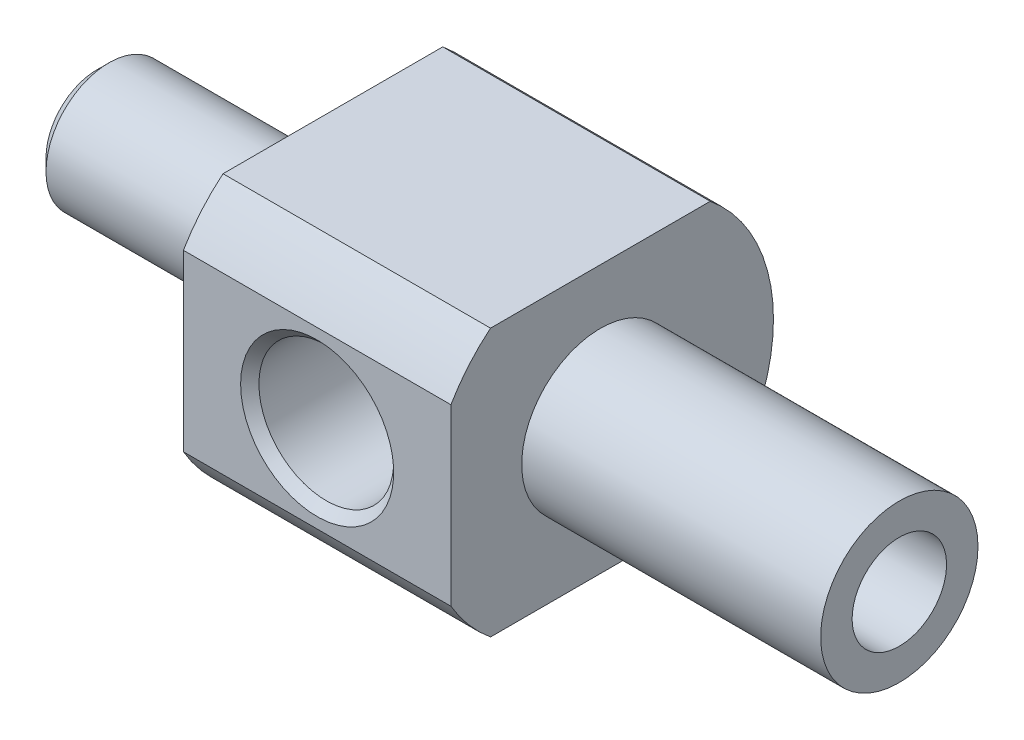
ISO-10303-21;
HEADER;
FILE_DESCRIPTION(('STEP AP214'),'2;1');
FILE_NAME('part.step','',(''),(''),'','','');
FILE_SCHEMA(('AUTOMOTIVE_DESIGN { 1 0 10303 214 1 1 1 1 }'));
ENDSEC;
DATA;
#1=APPLICATION_CONTEXT('core data for automotive mechanical design processes');
#2=APPLICATION_PROTOCOL_DEFINITION('international standard','automotive_design',2000,#1);
#3=PRODUCT_CONTEXT('',#1,'mechanical');
#4=PRODUCT('Part','Part','',(#3));
#5=PRODUCT_RELATED_PRODUCT_CATEGORY('part','',(#4));
#6=PRODUCT_DEFINITION_FORMATION('','',#4);
#7=PRODUCT_DEFINITION_CONTEXT('part definition',#1,'design');
#8=PRODUCT_DEFINITION('design','',#6,#7);
#9=PRODUCT_DEFINITION_SHAPE('','',#8);
#10=(LENGTH_UNIT() NAMED_UNIT(*) SI_UNIT(.MILLI.,.METRE.));
#11=(NAMED_UNIT(*) PLANE_ANGLE_UNIT() SI_UNIT($,.RADIAN.));
#12=(NAMED_UNIT(*) SI_UNIT($,.STERADIAN.) SOLID_ANGLE_UNIT());
#13=UNCERTAINTY_MEASURE_WITH_UNIT(LENGTH_MEASURE(1.E-05),#10,'distance_accuracy_value','');
#14=(GEOMETRIC_REPRESENTATION_CONTEXT(3) GLOBAL_UNCERTAINTY_ASSIGNED_CONTEXT((#13)) GLOBAL_UNIT_ASSIGNED_CONTEXT((#10,
#11,#12)) REPRESENTATION_CONTEXT('',''));
#15=CARTESIAN_POINT('',(0.,0.,0.));
#16=DIRECTION('',(0.,0.,1.));
#17=DIRECTION('',(1.,0.,0.));
#18=AXIS2_PLACEMENT_3D('',#15,#16,#17);
#19=CARTESIAN_POINT('',(19.,9.9192956952868,0.));
#20=DIRECTION('',(1.,0.,0.));
#21=DIRECTION('',(0.,0.,-1.));
#22=AXIS2_PLACEMENT_3D('',#19,#20,#21);
#23=PLANE('',#22);
#24=CARTESIAN_POINT('',(19.,0.,0.));
#25=DIRECTION('',(-1.,0.,0.));
#26=DIRECTION('',(0.,0.,1.));
#27=AXIS2_PLACEMENT_3D('',#24,#25,#26);
#28=CIRCLE('',#27,3.);
#29=CARTESIAN_POINT('',(19.,0.,3.));
#30=VERTEX_POINT('',#29);
#31=EDGE_CURVE('E89',#30,#30,#28,.T.);
#32=ORIENTED_EDGE('',*,*,#31,.T.);
#33=EDGE_LOOP('',(#32));
#34=FACE_BOUND('',#33,.T.);
#35=CARTESIAN_POINT('',(19.,0.,0.));
#36=DIRECTION('',(1.,0.,0.));
#37=DIRECTION('',(0.,0.,-1.));
#38=AXIS2_PLACEMENT_3D('',#35,#36,#37);
#39=CIRCLE('',#38,5.);
#40=CARTESIAN_POINT('',(19.,0.,-5.));
#41=VERTEX_POINT('',#40);
#42=EDGE_CURVE('E222',#41,#41,#39,.T.);
#43=ORIENTED_EDGE('',*,*,#42,.T.);
#44=EDGE_LOOP('',(#43));
#45=FACE_BOUND('',#44,.T.);
#46=ADVANCED_FACE('F17',(#34,#45),#23,.T.);
#47=CARTESIAN_POINT('',(-17.,5.5452682532047,9.5));
#48=DIRECTION('',(0.,0.,1.));
#49=DIRECTION('',(1.,0.,0.));
#50=AXIS2_PLACEMENT_3D('',#47,#48,#49);
#51=PLANE('',#50);
#52=DIRECTION('',(0.,-1.,0.));
#53=VECTOR('',#52,1.);
#54=CARTESIAN_POINT('',(0.,5.5452682532047,9.5));
#55=LINE('',#54,#53);
#56=CARTESIAN_POINT('',(0.,5.5452682532047,9.5));
#57=VERTEX_POINT('',#56);
#58=CARTESIAN_POINT('',(0.,-5.5452682532047,9.5));
#59=VERTEX_POINT('',#58);
#60=EDGE_CURVE('E128',#57,#59,#55,.T.);
#61=ORIENTED_EDGE('',*,*,#60,.F.);
#62=DIRECTION('',(1.,0.,0.));
#63=VECTOR('',#62,1.);
#64=CARTESIAN_POINT('',(-17.,5.5452682532047,9.5));
#65=LINE('',#64,#63);
#66=CARTESIAN_POINT('',(-17.,5.5452682532047,9.5));
#67=VERTEX_POINT('',#66);
#68=EDGE_CURVE('E29',#67,#57,#65,.T.);
#69=ORIENTED_EDGE('',*,*,#68,.F.);
#70=DIRECTION('',(0.,-1.,0.));
#71=VECTOR('',#70,1.);
#72=CARTESIAN_POINT('',(-17.,5.5452682532047,9.5));
#73=LINE('',#72,#71);
#74=CARTESIAN_POINT('',(-17.,-5.5452682532047,9.5));
#75=VERTEX_POINT('',#74);
#76=EDGE_CURVE('E149',#67,#75,#73,.T.);
#77=ORIENTED_EDGE('',*,*,#76,.T.);
#78=DIRECTION('',(1.,0.,0.));
#79=VECTOR('',#78,1.);
#80=CARTESIAN_POINT('',(-17.,-5.5452682532047,9.5));
#81=LINE('',#80,#79);
#82=EDGE_CURVE('E172',#75,#59,#81,.T.);
#83=ORIENTED_EDGE('',*,*,#82,.T.);
#84=EDGE_LOOP('',(#61,#69,#77,#83));
#85=FACE_BOUND('',#84,.T.);
#86=CARTESIAN_POINT('',(-8.5,0.,9.5));
#87=DIRECTION('',(0.,0.,-1.));
#88=DIRECTION('',(-1.,0.,0.));
#89=AXIS2_PLACEMENT_3D('',#86,#87,#88);
#90=CIRCLE('',#89,4.864);
#91=CARTESIAN_POINT('',(-13.364,0.,9.5));
#92=VERTEX_POINT('',#91);
#93=EDGE_CURVE('E96',#92,#92,#90,.T.);
#94=ORIENTED_EDGE('',*,*,#93,.T.);
#95=EDGE_LOOP('',(#94));
#96=FACE_BOUND('',#95,.T.);
#97=ADVANCED_FACE('F192',(#85,#96),#51,.T.);
#98=CARTESIAN_POINT('',(0.,-3.46944695195362E-13,-5.10008701937181E-13));
#99=DIRECTION('',(1.,0.,0.));
#100=DIRECTION('',(0.,1.,0.));
#101=AXIS2_PLACEMENT_3D('',#98,#99,#100);
#102=PLANE('',#101);
#103=DIRECTION('',(0.,0.,-1.));
#104=VECTOR('',#103,1.);
#105=CARTESIAN_POINT('',(0.,-8.5,6.9821200218845));
#106=LINE('',#105,#104);
#107=CARTESIAN_POINT('',(0.,-8.5,6.9821200218845));
#108=VERTEX_POINT('',#107);
#109=CARTESIAN_POINT('',(0.,-8.5,-6.9821200218845));
#110=VERTEX_POINT('',#109);
#111=EDGE_CURVE('E135',#108,#110,#106,.T.);
#112=ORIENTED_EDGE('',*,*,#111,.T.);
#113=CARTESIAN_POINT('',(0.,0.,0.));
#114=DIRECTION('',(1.,0.,0.));
#115=DIRECTION('',(0.,1.,0.));
#116=AXIS2_PLACEMENT_3D('',#113,#114,#115);
#117=CIRCLE('',#116,11.);
#118=CARTESIAN_POINT('',(0.,8.5,-6.9821200218845));
#119=VERTEX_POINT('',#118);
#120=EDGE_CURVE('E138',#110,#119,#117,.T.);
#121=ORIENTED_EDGE('',*,*,#120,.T.);
#122=DIRECTION('',(0.,0.,1.));
#123=VECTOR('',#122,1.);
#124=CARTESIAN_POINT('',(0.,8.5,-6.9821200218845));
#125=LINE('',#124,#123);
#126=CARTESIAN_POINT('',(0.,8.5,6.9821200218845));
#127=VERTEX_POINT('',#126);
#128=EDGE_CURVE('E142',#119,#127,#125,.T.);
#129=ORIENTED_EDGE('',*,*,#128,.T.);
#130=CARTESIAN_POINT('',(0.,-3.46944695195362E-13,-5.10008701937181E-13));
#131=DIRECTION('',(1.,0.,0.));
#132=DIRECTION('',(0.,1.,0.));
#133=AXIS2_PLACEMENT_3D('',#130,#131,#132);
#134=CIRCLE('',#133,11.0000000000006);
#135=EDGE_CURVE('E127',#127,#57,#134,.T.);
#136=ORIENTED_EDGE('',*,*,#135,.T.);
#137=ORIENTED_EDGE('',*,*,#60,.T.);
#138=CARTESIAN_POINT('',(0.,3.46944695195362E-13,-5.09141340199193E-13));
#139=DIRECTION('',(1.,0.,0.));
#140=DIRECTION('',(0.,1.,0.));
#141=AXIS2_PLACEMENT_3D('',#138,#139,#140);
#142=CIRCLE('',#141,11.0000000000006);
#143=EDGE_CURVE('E131',#59,#108,#142,.T.);
#144=ORIENTED_EDGE('',*,*,#143,.T.);
#145=EDGE_LOOP('',(#112,#121,#129,#136,#137,#144));
#146=FACE_BOUND('',#145,.T.);
#147=CARTESIAN_POINT('',(0.,0.,0.));
#148=DIRECTION('',(1.,0.,0.));
#149=DIRECTION('',(0.,0.,-1.));
#150=AXIS2_PLACEMENT_3D('',#147,#148,#149);
#151=CIRCLE('',#150,5.);
#152=CARTESIAN_POINT('',(0.,0.,-5.));
#153=VERTEX_POINT('',#152);
#154=EDGE_CURVE('E224',#153,#153,#151,.T.);
#155=ORIENTED_EDGE('',*,*,#154,.F.);
#156=EDGE_LOOP('',(#155));
#157=FACE_BOUND('',#156,.T.);
#158=ADVANCED_FACE('F180',(#146,#157),#102,.T.);
#159=CARTESIAN_POINT('',(-17.,-3.46944695195362E-13,-5.10008701937181E-13));
#160=DIRECTION('',(1.,0.,0.));
#161=DIRECTION('',(0.,0.,-1.));
#162=AXIS2_PLACEMENT_3D('',#159,#160,#161);
#163=CYLINDRICAL_SURFACE('',#162,11.0000000000006);
#164=ORIENTED_EDGE('',*,*,#135,.F.);
#165=DIRECTION('',(1.,0.,0.));
#166=VECTOR('',#165,1.);
#167=CARTESIAN_POINT('',(-17.,8.5,6.9821200218845));
#168=LINE('',#167,#166);
#169=CARTESIAN_POINT('',(-17.,8.5,6.9821200218845));
#170=VERTEX_POINT('',#169);
#171=EDGE_CURVE('E42',#170,#127,#168,.T.);
#172=ORIENTED_EDGE('',*,*,#171,.F.);
#173=CARTESIAN_POINT('',(-17.,-3.46944695195362E-13,-5.10008701937181E-13));
#174=DIRECTION('',(1.,0.,0.));
#175=DIRECTION('',(0.,1.,0.));
#176=AXIS2_PLACEMENT_3D('',#173,#174,#175);
#177=CIRCLE('',#176,11.0000000000006);
#178=EDGE_CURVE('E145',#170,#67,#177,.T.);
#179=ORIENTED_EDGE('',*,*,#178,.T.);
#180=ORIENTED_EDGE('',*,*,#68,.T.);
#181=EDGE_LOOP('',(#164,#172,#179,#180));
#182=FACE_BOUND('',#181,.T.);
#183=ADVANCED_FACE('F175',(#182),#163,.T.);
#184=CARTESIAN_POINT('',(-17.,3.46944695195362E-13,-5.09141340199193E-13));
#185=DIRECTION('',(1.,0.,0.));
#186=DIRECTION('',(0.,0.,-1.));
#187=AXIS2_PLACEMENT_3D('',#184,#185,#186);
#188=CYLINDRICAL_SURFACE('',#187,11.0000000000006);
#189=ORIENTED_EDGE('',*,*,#143,.F.);
#190=ORIENTED_EDGE('',*,*,#82,.F.);
#191=CARTESIAN_POINT('',(-17.,3.46944695195362E-13,-5.09141340199193E-13));
#192=DIRECTION('',(1.,0.,0.));
#193=DIRECTION('',(0.,1.,0.));
#194=AXIS2_PLACEMENT_3D('',#191,#192,#193);
#195=CIRCLE('',#194,11.0000000000006);
#196=CARTESIAN_POINT('',(-17.,-8.5,6.9821200218845));
#197=VERTEX_POINT('',#196);
#198=EDGE_CURVE('E152',#75,#197,#195,.T.);
#199=ORIENTED_EDGE('',*,*,#198,.T.);
#200=DIRECTION('',(1.,0.,0.));
#201=VECTOR('',#200,1.);
#202=CARTESIAN_POINT('',(-17.,-8.5,6.9821200218845));
#203=LINE('',#202,#201);
#204=EDGE_CURVE('E170',#197,#108,#203,.T.);
#205=ORIENTED_EDGE('',*,*,#204,.T.);
#206=EDGE_LOOP('',(#189,#190,#199,#205));
#207=FACE_BOUND('',#206,.T.);
#208=ADVANCED_FACE('F196',(#207),#188,.T.);
#209=CARTESIAN_POINT('',(-17.,-8.5,6.9821200218845));
#210=DIRECTION('',(0.,-1.,0.));
#211=DIRECTION('',(0.,0.,-1.));
#212=AXIS2_PLACEMENT_3D('',#209,#210,#211);
#213=PLANE('',#212);
#214=ORIENTED_EDGE('',*,*,#111,.F.);
#215=ORIENTED_EDGE('',*,*,#204,.F.);
#216=DIRECTION('',(0.,0.,-1.));
#217=VECTOR('',#216,1.);
#218=CARTESIAN_POINT('',(-17.,-8.5,6.9821200218845));
#219=LINE('',#218,#217);
#220=CARTESIAN_POINT('',(-17.,-8.5,-6.9821200218845));
#221=VERTEX_POINT('',#220);
#222=EDGE_CURVE('E155',#197,#221,#219,.T.);
#223=ORIENTED_EDGE('',*,*,#222,.T.);
#224=DIRECTION('',(1.,0.,0.));
#225=VECTOR('',#224,1.);
#226=CARTESIAN_POINT('',(-17.,-8.5,-6.9821200218845));
#227=LINE('',#226,#225);
#228=EDGE_CURVE('E167',#221,#110,#227,.T.);
#229=ORIENTED_EDGE('',*,*,#228,.T.);
#230=EDGE_LOOP('',(#214,#215,#223,#229));
#231=FACE_BOUND('',#230,.T.);
#232=ADVANCED_FACE('F199',(#231),#213,.T.);
#233=CARTESIAN_POINT('',(-17.,0.,0.));
#234=DIRECTION('',(1.,0.,0.));
#235=DIRECTION('',(0.,0.,-1.));
#236=AXIS2_PLACEMENT_3D('',#233,#234,#235);
#237=CYLINDRICAL_SURFACE('',#236,11.);
#238=ORIENTED_EDGE('',*,*,#120,.F.);
#239=ORIENTED_EDGE('',*,*,#228,.F.);
#240=CARTESIAN_POINT('',(-17.,0.,0.));
#241=DIRECTION('',(1.,0.,0.));
#242=DIRECTION('',(0.,1.,0.));
#243=AXIS2_PLACEMENT_3D('',#240,#241,#242);
#244=CIRCLE('',#243,11.);
#245=CARTESIAN_POINT('',(-17.,8.5,-6.9821200218845));
#246=VERTEX_POINT('',#245);
#247=EDGE_CURVE('E158',#221,#246,#244,.T.);
#248=ORIENTED_EDGE('',*,*,#247,.T.);
#249=DIRECTION('',(1.,0.,0.));
#250=VECTOR('',#249,1.);
#251=CARTESIAN_POINT('',(-17.,8.5,-6.9821200218845));
#252=LINE('',#251,#250);
#253=EDGE_CURVE('E165',#246,#119,#252,.T.);
#254=ORIENTED_EDGE('',*,*,#253,.T.);
#255=EDGE_LOOP('',(#238,#239,#248,#254));
#256=FACE_BOUND('',#255,.T.);
#257=ADVANCED_FACE('F201',(#256),#237,.T.);
#258=CARTESIAN_POINT('',(-17.,8.5,-6.9821200218845));
#259=DIRECTION('',(0.,1.,0.));
#260=DIRECTION('',(0.,0.,1.));
#261=AXIS2_PLACEMENT_3D('',#258,#259,#260);
#262=PLANE('',#261);
#263=ORIENTED_EDGE('',*,*,#128,.F.);
#264=ORIENTED_EDGE('',*,*,#253,.F.);
#265=DIRECTION('',(0.,0.,1.));
#266=VECTOR('',#265,1.);
#267=CARTESIAN_POINT('',(-17.,8.5,-6.9821200218845));
#268=LINE('',#267,#266);
#269=EDGE_CURVE('E161',#246,#170,#268,.T.);
#270=ORIENTED_EDGE('',*,*,#269,.T.);
#271=ORIENTED_EDGE('',*,*,#171,.T.);
#272=EDGE_LOOP('',(#263,#264,#270,#271));
#273=FACE_BOUND('',#272,.T.);
#274=ADVANCED_FACE('F185',(#273),#262,.T.);
#275=CARTESIAN_POINT('',(-17.,-3.46944695195362E-13,-5.10008701937181E-13));
#276=DIRECTION('',(1.,0.,0.));
#277=DIRECTION('',(0.,1.,0.));
#278=AXIS2_PLACEMENT_3D('',#275,#276,#277);
#279=PLANE('',#278);
#280=CARTESIAN_POINT('',(-17.,0.,0.));
#281=DIRECTION('',(-1.,0.,0.));
#282=DIRECTION('',(0.,0.,1.));
#283=AXIS2_PLACEMENT_3D('',#280,#281,#282);
#284=CIRCLE('',#283,3.3);
#285=CARTESIAN_POINT('',(-17.,0.,3.3));
#286=VERTEX_POINT('',#285);
#287=EDGE_CURVE('E106',#286,#286,#284,.T.);
#288=ORIENTED_EDGE('',*,*,#287,.F.);
#289=EDGE_LOOP('',(#288));
#290=FACE_BOUND('',#289,.T.);
#291=ORIENTED_EDGE('',*,*,#178,.F.);
#292=ORIENTED_EDGE('',*,*,#269,.F.);
#293=ORIENTED_EDGE('',*,*,#247,.F.);
#294=ORIENTED_EDGE('',*,*,#222,.F.);
#295=ORIENTED_EDGE('',*,*,#198,.F.);
#296=ORIENTED_EDGE('',*,*,#76,.F.);
#297=EDGE_LOOP('',(#291,#292,#293,#294,#295,#296));
#298=FACE_BOUND('',#297,.T.);
#299=ADVANCED_FACE('F189',(#290,#298),#279,.F.);
#300=CARTESIAN_POINT('',(-32.,0.,0.));
#301=DIRECTION('',(-1.,0.,0.));
#302=DIRECTION('',(0.,0.,1.));
#303=AXIS2_PLACEMENT_3D('',#300,#301,#302);
#304=PLANE('',#303);
#305=CARTESIAN_POINT('',(-32.,0.,0.));
#306=DIRECTION('',(-1.,0.,0.));
#307=DIRECTION('',(0.,0.,1.));
#308=AXIS2_PLACEMENT_3D('',#305,#306,#307);
#309=CIRCLE('',#308,3.233);
#310=CARTESIAN_POINT('',(-32.,0.,3.233));
#311=VERTEX_POINT('',#310);
#312=EDGE_CURVE('E124',#311,#311,#309,.T.);
#313=ORIENTED_EDGE('',*,*,#312,.T.);
#314=EDGE_LOOP('',(#313));
#315=FACE_BOUND('',#314,.T.);
#316=ADVANCED_FACE('F238',(#315),#304,.T.);
#317=CARTESIAN_POINT('',(-32.,0.,0.));
#318=DIRECTION('',(1.,0.,0.));
#319=DIRECTION('',(0.,0.,-1.));
#320=AXIS2_PLACEMENT_3D('',#317,#318,#319);
#321=CONICAL_SURFACE('',#320,3.233,0.785398163397448);
#322=CARTESIAN_POINT('',(-31.233,0.,0.));
#323=DIRECTION('',(-1.,0.,0.));
#324=DIRECTION('',(0.,0.,1.));
#325=AXIS2_PLACEMENT_3D('',#322,#323,#324);
#326=CIRCLE('',#325,4.);
#327=CARTESIAN_POINT('',(-31.233,0.,4.));
#328=VERTEX_POINT('',#327);
#329=EDGE_CURVE('E121',#328,#328,#326,.T.);
#330=ORIENTED_EDGE('',*,*,#329,.T.);
#331=EDGE_LOOP('',(#330));
#332=FACE_BOUND('',#331,.T.);
#333=ORIENTED_EDGE('',*,*,#312,.F.);
#334=EDGE_LOOP('',(#333));
#335=FACE_BOUND('',#334,.T.);
#336=ADVANCED_FACE('F245',(#332,#335),#321,.T.);
#337=CARTESIAN_POINT('',(-17.,0.,0.));
#338=DIRECTION('',(-1.,0.,0.));
#339=DIRECTION('',(0.,0.,1.));
#340=AXIS2_PLACEMENT_3D('',#337,#338,#339);
#341=CYLINDRICAL_SURFACE('',#340,4.);
#342=CARTESIAN_POINT('',(-19.5,0.,0.));
#343=DIRECTION('',(-1.,0.,0.));
#344=DIRECTION('',(0.,0.,1.));
#345=AXIS2_PLACEMENT_3D('',#342,#343,#344);
#346=CIRCLE('',#345,4.);
#347=CARTESIAN_POINT('',(-19.5,0.,4.));
#348=VERTEX_POINT('',#347);
#349=EDGE_CURVE('E118',#348,#348,#346,.T.);
#350=ORIENTED_EDGE('',*,*,#349,.T.);
#351=EDGE_LOOP('',(#350));
#352=FACE_BOUND('',#351,.T.);
#353=ORIENTED_EDGE('',*,*,#329,.F.);
#354=EDGE_LOOP('',(#353));
#355=FACE_BOUND('',#354,.T.);
#356=ADVANCED_FACE('F271',(#352,#355),#341,.T.);
#357=CARTESIAN_POINT('',(-19.5,0.,0.));
#358=DIRECTION('',(-1.,0.,0.));
#359=DIRECTION('',(0.,0.,1.));
#360=AXIS2_PLACEMENT_3D('',#357,#358,#359);
#361=CONICAL_SURFACE('',#360,4.,0.523598775598408);
#362=CARTESIAN_POINT('',(-17.883974596216,0.,0.));
#363=DIRECTION('',(-1.,0.,0.));
#364=DIRECTION('',(0.,0.,1.));
#365=AXIS2_PLACEMENT_3D('',#362,#363,#364);
#366=CIRCLE('',#365,3.0669872981078);
#367=CARTESIAN_POINT('',(-17.883974596216,0.,3.0669872981078));
#368=VERTEX_POINT('',#367);
#369=EDGE_CURVE('E115',#368,#368,#366,.T.);
#370=ORIENTED_EDGE('',*,*,#369,.T.);
#371=EDGE_LOOP('',(#370));
#372=FACE_BOUND('',#371,.T.);
#373=ORIENTED_EDGE('',*,*,#349,.F.);
#374=EDGE_LOOP('',(#373));
#375=FACE_BOUND('',#374,.T.);
#376=ADVANCED_FACE('F265',(#372,#375),#361,.T.);
#377=CARTESIAN_POINT('',(-17.6339745962152,0.,0.));
#378=DIRECTION('',(-1.,0.,0.));
#379=DIRECTION('',(0.,0.,1.));
#380=AXIS2_PLACEMENT_3D('',#377,#378,#379);
#381=TOROIDAL_SURFACE('',#380,3.50000000000261,0.500000000002605);
#382=CARTESIAN_POINT('',(-17.633974596216,0.,0.));
#383=DIRECTION('',(-1.,0.,0.));
#384=DIRECTION('',(0.,0.,1.));
#385=AXIS2_PLACEMENT_3D('',#382,#383,#384);
#386=CIRCLE('',#385,3.);
#387=CARTESIAN_POINT('',(-17.633974596216,0.,3.));
#388=VERTEX_POINT('',#387);
#389=EDGE_CURVE('E112',#388,#388,#386,.T.);
#390=ORIENTED_EDGE('',*,*,#389,.T.);
#391=EDGE_LOOP('',(#390));
#392=FACE_BOUND('',#391,.T.);
#393=ORIENTED_EDGE('',*,*,#369,.F.);
#394=EDGE_LOOP('',(#393));
#395=FACE_BOUND('',#394,.T.);
#396=ADVANCED_FACE('F259',(#392,#395),#381,.F.);
#397=CARTESIAN_POINT('',(-17.,0.,0.));
#398=DIRECTION('',(-1.,0.,0.));
#399=DIRECTION('',(0.,0.,1.));
#400=AXIS2_PLACEMENT_3D('',#397,#398,#399);
#401=CYLINDRICAL_SURFACE('',#400,3.);
#402=CARTESIAN_POINT('',(-17.3,0.,0.));
#403=DIRECTION('',(-1.,0.,0.));
#404=DIRECTION('',(0.,0.,1.));
#405=AXIS2_PLACEMENT_3D('',#402,#403,#404);
#406=CIRCLE('',#405,3.);
#407=CARTESIAN_POINT('',(-17.3,0.,3.));
#408=VERTEX_POINT('',#407);
#409=EDGE_CURVE('E109',#408,#408,#406,.T.);
#410=ORIENTED_EDGE('',*,*,#409,.T.);
#411=EDGE_LOOP('',(#410));
#412=FACE_BOUND('',#411,.T.);
#413=ORIENTED_EDGE('',*,*,#389,.F.);
#414=EDGE_LOOP('',(#413));
#415=FACE_BOUND('',#414,.T.);
#416=ADVANCED_FACE('F253',(#412,#415),#401,.T.);
#417=CARTESIAN_POINT('',(-17.3,0.,0.));
#418=DIRECTION('',(-1.,0.,0.));
#419=DIRECTION('',(0.,0.,1.));
#420=AXIS2_PLACEMENT_3D('',#417,#418,#419);
#421=TOROIDAL_SURFACE('',#420,3.29999999999988,0.299999999999877);
#422=ORIENTED_EDGE('',*,*,#287,.T.);
#423=EDGE_LOOP('',(#422));
#424=FACE_BOUND('',#423,.T.);
#425=ORIENTED_EDGE('',*,*,#409,.F.);
#426=EDGE_LOOP('',(#425));
#427=FACE_BOUND('',#426,.T.);
#428=ADVANCED_FACE('F249',(#424,#427),#421,.F.);
#429=CARTESIAN_POINT('',(-8.5,0.,9.5));
#430=DIRECTION('',(0.,0.,1.));
#431=DIRECTION('',(1.,0.,0.));
#432=AXIS2_PLACEMENT_3D('',#429,#430,#431);
#433=CONICAL_SURFACE('',#432,4.864,0.78539816339745);
#434=CARTESIAN_POINT('',(-8.5,0.,8.919));
#435=DIRECTION('',(0.,0.,-1.));
#436=DIRECTION('',(-1.,0.,0.));
#437=AXIS2_PLACEMENT_3D('',#434,#435,#436);
#438=CIRCLE('',#437,4.283);
#439=CARTESIAN_POINT('',(-12.783,0.,8.919));
#440=VERTEX_POINT('',#439);
#441=EDGE_CURVE('E93',#440,#440,#438,.T.);
#442=ORIENTED_EDGE('',*,*,#441,.T.);
#443=EDGE_LOOP('',(#442));
#444=FACE_BOUND('',#443,.T.);
#445=ORIENTED_EDGE('',*,*,#93,.F.);
#446=EDGE_LOOP('',(#445));
#447=FACE_BOUND('',#446,.T.);
#448=ADVANCED_FACE('F252',(#444,#447),#433,.F.);
#449=CARTESIAN_POINT('',(-8.5,0.,-3.9727912029392));
#450=DIRECTION('',(0.,0.,-1.));
#451=DIRECTION('',(-1.,0.,0.));
#452=AXIS2_PLACEMENT_3D('',#449,#450,#451);
#453=CYLINDRICAL_SURFACE('',#452,4.283);
#454=CARTESIAN_POINT('',(-5.09499060206877,-2.59807621135332,-1.5));
#455=CARTESIAN_POINT('',(-5.14643897990485,-2.66555205468365,-1.38321838110718));
#456=CARTESIAN_POINT('',(-5.19566971255237,-2.72583741373303,-1.26051282851999));
#457=CARTESIAN_POINT('',(-5.28486805720291,-2.83050745682597,-1.00378229670098));
#458=CARTESIAN_POINT('',(-5.32473456783957,-2.8747211871025,-0.86965334491157));
#459=CARTESIAN_POINT('',(-5.3731552787845,-2.9270297185977,-0.661575508104667));
#460=CARTESIAN_POINT('',(-5.38743895564554,-2.94216820735549,-0.590718675723728));
#461=CARTESIAN_POINT('',(-5.41143438842445,-2.9673482031553,-0.447364075866029));
#462=CARTESIAN_POINT('',(-5.42114853340394,-2.97739237384514,-0.374867186677481));
#463=CARTESIAN_POINT('',(-5.43545962206365,-2.99212122549835,-0.2292086196028));
#464=CARTESIAN_POINT('',(-5.44008327808706,-2.99683388718879,-0.156052462729125));
#465=CARTESIAN_POINT('',(-5.44405578892051,-3.00088243350498,-0.00947376917838775));
#466=CARTESIAN_POINT('',(-5.44340543726196,-3.00021912700321,0.0639487257636213));
#467=CARTESIAN_POINT('',(-5.43447073439106,-2.99110829039129,0.262687497067342));
#468=CARTESIAN_POINT('',(-5.42106362934408,-2.97743727958967,0.387596789932113));
#469=CARTESIAN_POINT('',(-5.38075261287109,-2.93516569074894,0.632759317983158));
#470=CARTESIAN_POINT('',(-5.35381269618642,-2.9065252769988,0.752999205506553));
#471=CARTESIAN_POINT('',(-5.27921406522267,-2.82394130340411,1.02559899368388));
#472=CARTESIAN_POINT('',(-5.22764099154201,-2.76474243047206,1.17528073579735));
#473=CARTESIAN_POINT('',(-5.11477756276103,-2.62533783544851,1.46044211717049));
#474=CARTESIAN_POINT('',(-5.05347412742034,-2.54510374032478,1.59590222553891));
#475=CARTESIAN_POINT('',(-4.92623334405507,-2.36324188384552,1.85491753025794));
#476=CARTESIAN_POINT('',(-4.86021928958885,-2.2611384276111,1.97810005360652));
#477=CARTESIAN_POINT('',(-4.73072170472361,-2.03795457729084,2.207326970528));
#478=CARTESIAN_POINT('',(-4.66723650969226,-1.91688693431228,2.31338278311467));
#479=CARTESIAN_POINT('',(-4.55088677810456,-1.66344838582562,2.5013099424099));
#480=CARTESIAN_POINT('',(-4.49764725946898,-1.53196008583538,2.58413387231191));
#481=CARTESIAN_POINT('',(-4.40219248417981,-1.25439234956966,2.72964446066826));
#482=CARTESIAN_POINT('',(-4.35997321385633,-1.10831825244139,2.79233845253992));
#483=CARTESIAN_POINT('',(-4.30769651717903,-0.880270598005539,2.86908718501776));
#484=CARTESIAN_POINT('',(-4.29206836736669,-0.802397575192171,2.89185033058226));
#485=CARTESIAN_POINT('',(-4.26499625589157,-0.644391365805389,2.93110439810488));
#486=CARTESIAN_POINT('',(-4.25355015870265,-0.564259355344556,2.94759852145436));
#487=CARTESIAN_POINT('',(-4.23517264805991,-0.40244461375424,2.97401303697895));
#488=CARTESIAN_POINT('',(-4.22823896338884,-0.320762684080546,2.98393673626698));
#489=CARTESIAN_POINT('',(-4.21907402207021,-0.156626912828131,2.99704137517722));
#490=CARTESIAN_POINT('',(-4.21684210636021,-0.0741731810631904,3.00022325982216));
#491=CARTESIAN_POINT('',(-4.21729542726824,0.151136476396636,2.99958196802863));
#492=CARTESIAN_POINT('',(-4.22477284169033,0.294048891958085,2.98893056246272));
#493=CARTESIAN_POINT('',(-4.25347038143722,0.57544374411952,2.94773369976641));
#494=CARTESIAN_POINT('',(-4.27469134673982,0.71392590940874,2.91718702667721));
#495=CARTESIAN_POINT('',(-4.32876054752323,0.981461436825227,2.83830289498312));
#496=CARTESIAN_POINT('',(-4.36147153589886,1.11060529006112,2.79017517996332));
#497=CARTESIAN_POINT('',(-4.43620280503518,1.35885007366703,2.67807776007021));
#498=CARTESIAN_POINT('',(-4.47822472408565,1.47794923154094,2.61410526702086));
#499=CARTESIAN_POINT('',(-4.57500509402284,1.7197782668163,2.46278914635376));
#500=CARTESIAN_POINT('',(-4.63071406870007,1.84088624605892,2.37346921199696));
#501=CARTESIAN_POINT('',(-4.74681947339068,2.06735647965887,2.17907281419895));
#502=CARTESIAN_POINT('',(-4.80722267807584,2.17269531010203,2.07397336627916));
#503=CARTESIAN_POINT('',(-4.9391102694102,2.38373544439904,1.82982335348781));
#504=CARTESIAN_POINT('',(-5.01067826262026,2.486253342677,1.68805166261075));
#505=CARTESIAN_POINT('',(-5.14628129724781,2.66633373423226,1.38617125906181));
#506=CARTESIAN_POINT('',(-5.21032530459448,2.74392612521006,1.22608482968206));
#507=CARTESIAN_POINT('',(-5.30439192144815,2.85232534506754,0.938340207453609));
#508=CARTESIAN_POINT('',(-5.33889051787159,2.89017662723589,0.814818949133583));
#509=CARTESIAN_POINT('',(-5.39455439178614,2.94991268998535,0.561174147916887));
#510=CARTESIAN_POINT('',(-5.41574677611353,2.97182994515721,0.431064614896017));
#511=CARTESIAN_POINT('',(-5.44150479319684,2.99834578571577,0.166431982460142));
#512=CARTESIAN_POINT('',(-5.44595200611161,3.0028210310734,0.0318842116408621));
#513=CARTESIAN_POINT('',(-5.43701945343497,2.99370444790419,-0.236046385168318));
#514=CARTESIAN_POINT('',(-5.42362967579335,2.98010247249398,-0.369428514562157));
#515=CARTESIAN_POINT('',(-5.38337551133569,2.93793662457671,-0.618975783832302));
#516=CARTESIAN_POINT('',(-5.35782123438522,2.91081737378157,-0.735614725341648));
#517=CARTESIAN_POINT('',(-5.29709018809383,2.84385089895169,-0.962558728009907));
#518=CARTESIAN_POINT('',(-5.26190837003373,2.80399699497267,-1.07286042907254));
#519=CARTESIAN_POINT('',(-5.2035453853106,2.73467376508736,-1.23499545086463));
#520=CARTESIAN_POINT('',(-5.18268815169469,2.70937446567385,-1.28952718973043));
#521=CARTESIAN_POINT('',(-5.13970543799058,2.65587749781534,-1.39637516696402));
#522=CARTESIAN_POINT('',(-5.11758450504858,2.62768996321666,-1.44869829979397));
#523=CARTESIAN_POINT('',(-5.09499060206877,2.59807621135332,-1.5));
#524=B_SPLINE_CURVE_WITH_KNOTS('',3,(#454,#455,#456,#457,#458,#459,#460,#461,#462,#463,#464,
#465,#466,#467,#468,#469,#470,#471,#472,#473,#474,#475,#476,#477,#478,#479,#480,#481,#482,#483,
#484,#485,#486,#487,#488,#489,#490,#491,#492,#493,#494,#495,#496,#497,#498,#499,#500,#501,#502,
#503,#504,#505,#506,#507,#508,#509,#510,#511,#512,#513,#514,#515,#516,#517,#518,#519,#520,#521,
#522,#523),.UNSPECIFIED.,.F.,.F.,(4,2,2,2,2,2,2,2,2,2,2,2,2,2,2,2,2,2,2,2,2,2,2,2,2,2,2,2,2,2,2,
2,2,2,4),(0.,0.433827976385261,0.872144146151287,1.09339581939433,1.31453168799863,
1.53450153195279,1.75443827968321,2.13152876748291,2.50962789475134,3.01395533215434,
3.51896655520768,4.0363421835249,4.55337142123838,5.04422397519287,5.53489750616224,
5.78245323390619,6.02988237236812,6.27718687664778,6.52445671313327,6.95263465588133,
7.3808387704615,7.80409284449001,8.22742145072893,8.70702315494258,9.18733035011916,
9.75196500125074,10.3159198321603,10.7156035627597,11.1144704105472,11.5161527556376,
11.9180606633774,12.2840769127269,12.6502854714314,12.8410785520575,13.0312237482933),.UNSPECIFIED.);
#525=CARTESIAN_POINT('',(-5.09499060206877,-2.59807621135332,-1.5));
#526=VERTEX_POINT('',#525);
#527=CARTESIAN_POINT('',(-5.09499060206877,2.59807621135332,-1.5));
#528=VERTEX_POINT('',#527);
#529=EDGE_CURVE('E34',#526,#528,#524,.T.);
#530=ORIENTED_EDGE('',*,*,#529,.F.);
#531=CARTESIAN_POINT('',(-8.5,0.,-1.5));
#532=DIRECTION('',(0.,0.,-1.));
#533=DIRECTION('',(-1.,0.,0.));
#534=AXIS2_PLACEMENT_3D('',#531,#532,#533);
#535=CIRCLE('',#534,4.283);
#536=EDGE_CURVE('E88',#526,#528,#535,.T.);
#537=ORIENTED_EDGE('',*,*,#536,.T.);
#538=EDGE_LOOP('',(#530,#537));
#539=FACE_BOUND('',#538,.T.);
#540=ORIENTED_EDGE('',*,*,#441,.F.);
#541=EDGE_LOOP('',(#540));
#542=FACE_BOUND('',#541,.T.);
#543=ADVANCED_FACE('F86',(#539,#542),#453,.F.);
#544=CARTESIAN_POINT('',(-8.5,0.,-1.5));
#545=DIRECTION('',(0.,0.,1.));
#546=DIRECTION('',(1.,0.,0.));
#547=AXIS2_PLACEMENT_3D('',#544,#545,#546);
#548=CONICAL_SURFACE('',#547,4.283,1.0471975511966);
#549=CARTESIAN_POINT('',(-4.83091174920946,2.67918643621531,-1.34979999999996));
#550=CARTESIAN_POINT('',(-4.93029808043359,2.65094839083161,-1.40576516188835));
#551=CARTESIAN_POINT('',(-5.02901765874729,2.62050318171131,-1.46190728555225));
#552=CARTESIAN_POINT('',(-5.22473219101611,2.55426104641248,-1.57483696392554));
#553=CARTESIAN_POINT('',(-5.32172033888784,2.51844670498277,-1.63162604175127));
#554=CARTESIAN_POINT('',(-5.51527853170864,2.43974293023354,-1.74718410553754));
#555=CARTESIAN_POINT('',(-5.61177879273089,2.39670030194599,-1.80596730345001));
#556=CARTESIAN_POINT('',(-5.80038875853483,2.30288286219569,-1.92416916363516));
#557=CARTESIAN_POINT('',(-5.89250448831608,2.25211908859299,-1.98358680794226));
#558=CARTESIAN_POINT('',(-6.06793889727558,2.14236408929826,-2.10157190897448));
#559=CARTESIAN_POINT('',(-6.15142611465859,2.08362683197315,-2.16012010810404));
#560=CARTESIAN_POINT('',(-6.30853570201755,1.95481865726559,-2.27732940857505));
#561=CARTESIAN_POINT('',(-6.38220352493435,1.88480352786397,-2.3359886171568));
#562=CARTESIAN_POINT('',(-6.5034186725603,1.74415703333577,-2.44218377356179));
#563=CARTESIAN_POINT('',(-6.55327926113659,1.67570069517417,-2.48989838859588));
#564=CARTESIAN_POINT('',(-6.63948306990029,1.52916547881341,-2.58246132265763));
#565=CARTESIAN_POINT('',(-6.67585926076044,1.45111070110332,-2.62731640792627));
#566=CARTESIAN_POINT('',(-6.73400089499283,1.28714083873599,-2.71140802300602));
#567=CARTESIAN_POINT('',(-6.75578308766672,1.20123489391942,-2.75065095295557));
#568=CARTESIAN_POINT('',(-6.78754868640386,1.02400811974763,-2.82144863843228));
#569=CARTESIAN_POINT('',(-6.79748561211577,0.932667425950158,-2.85297272383761));
#570=CARTESIAN_POINT('',(-6.8090758358777,0.763494703572859,-2.9023134429069));
#571=CARTESIAN_POINT('',(-6.81188501085018,0.686137165206426,-2.92156920493513));
#572=CARTESIAN_POINT('',(-6.81509579366936,0.530049219603839,-2.95387892064186));
#573=CARTESIAN_POINT('',(-6.81549595360706,0.451318015243521,-2.96692914021649));
#574=CARTESIAN_POINT('',(-6.81562708421462,0.292945411276292,-2.98673124429765));
#575=CARTESIAN_POINT('',(-6.81535698478269,0.213302758505158,-2.99347303342989));
#576=CARTESIAN_POINT('',(-6.81506253889965,0.0537590912041003,-3.00058051734203));
#577=CARTESIAN_POINT('',(-6.81503810968809,-0.0261418272480676,-3.00094835938347));
#578=CARTESIAN_POINT('',(-6.81529091151038,-0.188050971741713,-2.99522766147385));
#579=CARTESIAN_POINT('',(-6.8155769780577,-0.270052552024785,-2.98895014891302));
#580=CARTESIAN_POINT('',(-6.81556400589817,-0.433313253407197,-2.96968027655066));
#581=CARTESIAN_POINT('',(-6.81526462306194,-0.514571909605315,-2.95668397071997));
#582=CARTESIAN_POINT('',(-6.81223144941385,-0.675427248987235,-2.92412397868145));
#583=CARTESIAN_POINT('',(-6.80950674256732,-0.755029000552098,-2.90458496813712));
#584=CARTESIAN_POINT('',(-6.79903817594511,-0.912006052051987,-2.85918065339496));
#585=CARTESIAN_POINT('',(-6.79130057206547,-0.989384001675524,-2.83332325930482));
#586=CARTESIAN_POINT('',(-6.76547571701203,-1.15620286470597,-2.76995356920054));
#587=CARTESIAN_POINT('',(-6.7456091132255,-1.24491130586207,-2.73114133311205));
#588=CARTESIAN_POINT('',(-6.69098064639752,-1.41431658658822,-2.64738142006239));
#589=CARTESIAN_POINT('',(-6.65625449307627,-1.49503206543872,-2.6024486270582));
#590=CARTESIAN_POINT('',(-6.57276151004668,-1.64626861210253,-2.50952064681711));
#591=CARTESIAN_POINT('',(-6.52404076166363,-1.71682201499563,-2.46153590632403));
#592=CARTESIAN_POINT('',(-6.41566183661612,-1.84830119194481,-2.3644247987247));
#593=CARTESIAN_POINT('',(-6.35596821325543,-1.90919453701075,-2.31529519584304));
#594=CARTESIAN_POINT('',(-6.23270045243051,-2.01913066753678,-2.21993136167939));
#595=CARTESIAN_POINT('',(-6.16954704593399,-2.06865363949986,-2.17369314265738));
#596=CARTESIAN_POINT('',(-6.03847284607075,-2.1613594080935,-2.08153771209492));
#597=CARTESIAN_POINT('',(-5.97054745989661,-2.20453596954375,-2.03562085790286));
#598=CARTESIAN_POINT('',(-5.83111893618322,-2.2856737274406,-1.94407974650804));
#599=CARTESIAN_POINT('',(-5.75960508986273,-2.32361787025466,-1.89845688751871));
#600=CARTESIAN_POINT('',(-5.61408926840116,-2.39496564128026,-1.80761510970068));
#601=CARTESIAN_POINT('',(-5.54008653544513,-2.42836787067153,-1.76239631930513));
#602=CARTESIAN_POINT('',(-5.36173335111837,-2.503219527507,-1.65518861797701));
#603=CARTESIAN_POINT('',(-5.25654346436396,-2.5428991211504,-1.59336120915013));
#604=CARTESIAN_POINT('',(-5.09747475105518,-2.59753629460462,-1.50135087318791));
#605=CARTESIAN_POINT('',(-5.04450789047592,-2.61485976192184,-1.47095389656605));
#606=CARTESIAN_POINT('',(-4.93807107815102,-2.64807166151173,-1.41028764749657));
#607=CARTESIAN_POINT('',(-4.8846012495642,-2.66396043548338,-1.38001834628657));
#608=CARTESIAN_POINT('',(-4.83091174920946,-2.67918643621531,-1.34979999999996));
#609=B_SPLINE_CURVE_WITH_KNOTS('',3,(#549,#550,#551,#552,#553,#554,#555,#556,#557,#558,#559,
#560,#561,#562,#563,#564,#565,#566,#567,#568,#569,#570,#571,#572,#573,#574,#575,#576,#577,#578,
#579,#580,#581,#582,#583,#584,#585,#586,#587,#588,#589,#590,#591,#592,#593,#594,#595,#596,#597,
#598,#599,#600,#601,#602,#603,#604,#605,#606,#607,#608),.UNSPECIFIED.,.F.,.F.,(4,2,2,2,2,2,2,2,
2,2,2,2,2,2,2,2,2,2,2,2,2,2,2,2,2,2,2,2,2,4),(0.,0.352563962689026,0.706297282741132,
1.06878716810302,1.43076363921419,1.7831380531068,2.13382008930712,2.42421737955687,
2.71389986180307,3.00324930791101,3.29373045090961,3.53273614066054,3.77188546752651,
4.01141685354002,4.25086754441626,4.49731509764018,4.74390755722742,4.98958028176277,
5.23494700555625,5.53002902870604,5.82440587332878,6.11782429436805,6.41220778330586,
6.68965766468191,6.96737833691784,7.24598378734729,7.52467484938251,7.90934060325373,
8.09976415433467,8.2901422322065),.UNSPECIFIED.);
#610=EDGE_CURVE('E10',#528,#526,#609,.T.);
#611=ORIENTED_EDGE('',*,*,#610,.F.);
#612=ORIENTED_EDGE('',*,*,#536,.F.);
#613=EDGE_LOOP('',(#611,#612));
#614=FACE_BOUND('',#613,.T.);
#615=CARTESIAN_POINT('',(-8.5,0.,-3.9727912029392));
#616=VERTEX_POINT('',#615);
#617=VERTEX_LOOP('',#616);
#618=FACE_BOUND('',#617,.T.);
#619=ADVANCED_FACE('F91',(#614,#618),#548,.F.);
#620=CARTESIAN_POINT('',(19.,0.,0.));
#621=DIRECTION('',(-1.,0.,0.));
#622=DIRECTION('',(0.,0.,1.));
#623=AXIS2_PLACEMENT_3D('',#620,#621,#622);
#624=CYLINDRICAL_SURFACE('',#623,3.);
#625=ORIENTED_EDGE('',*,*,#31,.F.);
#626=EDGE_LOOP('',(#625));
#627=FACE_BOUND('',#626,.T.);
#628=ORIENTED_EDGE('',*,*,#529,.T.);
#629=ORIENTED_EDGE('',*,*,#610,.T.);
#630=EDGE_LOOP('',(#628,#629));
#631=FACE_BOUND('',#630,.T.);
#632=ADVANCED_FACE('F81',(#627,#631),#624,.F.);
#633=CARTESIAN_POINT('',(0.,0.,0.));
#634=DIRECTION('',(1.,0.,0.));
#635=DIRECTION('',(0.,0.,-1.));
#636=AXIS2_PLACEMENT_3D('',#633,#634,#635);
#637=CYLINDRICAL_SURFACE('',#636,5.);
#638=ORIENTED_EDGE('',*,*,#154,.T.);
#639=EDGE_LOOP('',(#638));
#640=FACE_BOUND('',#639,.T.);
#641=ORIENTED_EDGE('',*,*,#42,.F.);
#642=EDGE_LOOP('',(#641));
#643=FACE_BOUND('',#642,.T.);
#644=ADVANCED_FACE('F230',(#640,#643),#637,.T.);
#645=CLOSED_SHELL('',(#46,#97,#158,#183,#208,#232,#257,#274,#299,#316,#336,#356,#376,#396,#416,
#428,#448,#543,#619,#632,#644));
#646=MANIFOLD_SOLID_BREP('B1',#645);
#647=ADVANCED_BREP_SHAPE_REPRESENTATION('',(#18,#646),#14);
#648=SHAPE_DEFINITION_REPRESENTATION(#9,#647);
ENDSEC;
END-ISO-10303-21;
